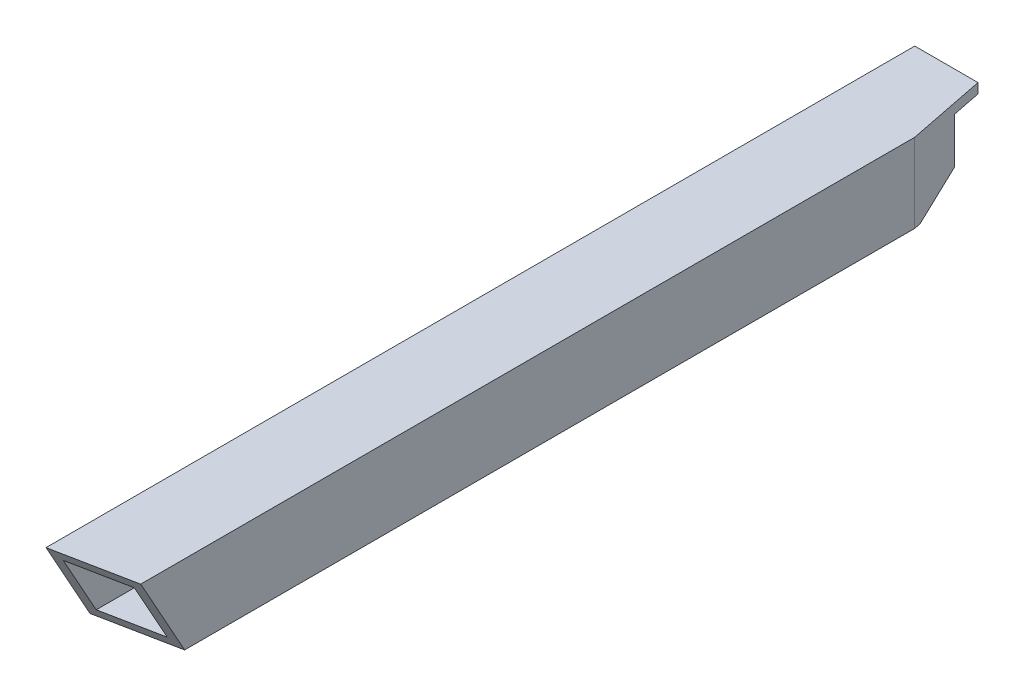
ISO-10303-21;
HEADER;
FILE_DESCRIPTION(('STEP AP214'),'2;1');
FILE_NAME('part.step','',(''),(''),'','','');
FILE_SCHEMA(('AUTOMOTIVE_DESIGN { 1 0 10303 214 1 1 1 1 }'));
ENDSEC;
DATA;
#1=APPLICATION_CONTEXT('core data for automotive mechanical design processes');
#2=APPLICATION_PROTOCOL_DEFINITION('international standard','automotive_design',2000,#1);
#3=PRODUCT_CONTEXT('',#1,'mechanical');
#4=PRODUCT('Part','Part','',(#3));
#5=PRODUCT_RELATED_PRODUCT_CATEGORY('part','',(#4));
#6=PRODUCT_DEFINITION_FORMATION('','',#4);
#7=PRODUCT_DEFINITION_CONTEXT('part definition',#1,'design');
#8=PRODUCT_DEFINITION('design','',#6,#7);
#9=PRODUCT_DEFINITION_SHAPE('','',#8);
#10=(LENGTH_UNIT() NAMED_UNIT(*) SI_UNIT(.MILLI.,.METRE.));
#11=(NAMED_UNIT(*) PLANE_ANGLE_UNIT() SI_UNIT($,.RADIAN.));
#12=(NAMED_UNIT(*) SI_UNIT($,.STERADIAN.) SOLID_ANGLE_UNIT());
#13=UNCERTAINTY_MEASURE_WITH_UNIT(LENGTH_MEASURE(1.E-05),#10,'distance_accuracy_value','');
#14=(GEOMETRIC_REPRESENTATION_CONTEXT(3) GLOBAL_UNCERTAINTY_ASSIGNED_CONTEXT((#13)) GLOBAL_UNIT_ASSIGNED_CONTEXT((#10,
#11,#12)) REPRESENTATION_CONTEXT('',''));
#15=CARTESIAN_POINT('',(0.,0.,0.));
#16=DIRECTION('',(0.,0.,1.));
#17=DIRECTION('',(1.,0.,0.));
#18=AXIS2_PLACEMENT_3D('',#15,#16,#17);
#19=CARTESIAN_POINT('',(12.7,-12.7,139.7));
#20=DIRECTION('',(0.,1.,0.));
#21=DIRECTION('',(0.,0.,1.));
#22=AXIS2_PLACEMENT_3D('',#19,#20,#21);
#23=PLANE('',#22);
#24=DIRECTION('',(-0.999378196944264,0.,-0.0352593175264528));
#25=VECTOR('',#24,1.);
#26=CARTESIAN_POINT('',(21.7243575424984,-12.7,-116.08334471835));
#27=LINE('',#26,#25);
#28=CARTESIAN_POINT('',(12.2785974410021,-12.7,-116.416602994061));
#29=VERTEX_POINT('',#28);
#30=CARTESIAN_POINT('',(-12.7,-12.7,-117.297879272882));
#31=VERTEX_POINT('',#30);
#32=EDGE_CURVE('E125',#29,#31,#27,.T.);
#33=ORIENTED_EDGE('',*,*,#32,.F.);
#34=DIRECTION('',(-0.195261498367845,0.,-0.98075121578061));
#35=VECTOR('',#34,1.);
#36=CARTESIAN_POINT('',(61.3417497875296,-12.7,130.015728602807));
#37=LINE('',#36,#35);
#38=CARTESIAN_POINT('',(12.7,-12.7,-114.3));
#39=VERTEX_POINT('',#38);
#40=EDGE_CURVE('E65',#39,#29,#37,.T.);
#41=ORIENTED_EDGE('',*,*,#40,.F.);
#42=DIRECTION('',(0.,0.,-1.));
#43=VECTOR('',#42,1.);
#44=CARTESIAN_POINT('',(12.7,-12.7,139.7));
#45=LINE('',#44,#43);
#46=CARTESIAN_POINT('',(12.7,-12.7,120.516824075556));
#47=VERTEX_POINT('',#46);
#48=EDGE_CURVE('E214',#47,#39,#45,.T.);
#49=ORIENTED_EDGE('',*,*,#48,.F.);
#50=DIRECTION('',(0.98075121578061,0.,-0.195261498367845));
#51=VECTOR('',#50,1.);
#52=CARTESIAN_POINT('',(9.0263651832796,-12.7,121.248222035841));
#53=LINE('',#52,#51);
#54=CARTESIAN_POINT('',(-12.7,-12.7,125.573806905392));
#55=VERTEX_POINT('',#54);
#56=EDGE_CURVE('E168',#55,#47,#53,.T.);
#57=ORIENTED_EDGE('',*,*,#56,.F.);
#58=DIRECTION('',(0.,0.,-1.));
#59=VECTOR('',#58,1.);
#60=CARTESIAN_POINT('',(-12.7,-12.7,139.7));
#61=LINE('',#60,#59);
#62=EDGE_CURVE('E132',#55,#31,#61,.T.);
#63=ORIENTED_EDGE('',*,*,#62,.T.);
#64=EDGE_LOOP('',(#33,#41,#49,#57,#63));
#65=FACE_BOUND('',#64,.T.);
#66=ADVANCED_FACE('F42',(#65),#23,.F.);
#67=CARTESIAN_POINT('',(9.525,-9.525,139.7));
#68=DIRECTION('',(0.,1.,0.));
#69=DIRECTION('',(0.,0.,1.));
#70=AXIS2_PLACEMENT_3D('',#67,#68,#69);
#71=PLANE('',#70);
#72=DIRECTION('',(0.,0.,-1.));
#73=VECTOR('',#72,1.);
#74=CARTESIAN_POINT('',(9.525,-9.525,139.7));
#75=LINE('',#74,#73);
#76=CARTESIAN_POINT('',(9.525,-9.525,122.914721066111));
#77=VERTEX_POINT('',#76);
#78=CARTESIAN_POINT('',(9.525,-9.52499999999999,-122.338319523298));
#79=VERTEX_POINT('',#78);
#80=EDGE_CURVE('E198',#77,#79,#75,.T.);
#81=ORIENTED_EDGE('',*,*,#80,.T.);
#82=DIRECTION('',(-0.999378196944264,0.,-0.0352593175264528));
#83=VECTOR('',#82,1.);
#84=CARTESIAN_POINT('',(18.7585472919775,-9.525,-122.012548381944));
#85=LINE('',#84,#83);
#86=CARTESIAN_POINT('',(-9.52499999999999,-9.525,-123.010427440934));
#87=VERTEX_POINT('',#86);
#88=EDGE_CURVE('E135',#79,#87,#85,.T.);
#89=ORIENTED_EDGE('',*,*,#88,.T.);
#90=DIRECTION('',(0.,0.,-1.));
#91=VECTOR('',#90,1.);
#92=CARTESIAN_POINT('',(-9.52499999999999,-9.525,139.7));
#93=LINE('',#92,#91);
#94=CARTESIAN_POINT('',(-9.52499999999999,-9.525,126.707458188488));
#95=VERTEX_POINT('',#94);
#96=EDGE_CURVE('E202',#95,#87,#93,.T.);
#97=ORIENTED_EDGE('',*,*,#96,.F.);
#98=DIRECTION('',(0.98075121578061,0.,-0.195261498367845));
#99=VECTOR('',#98,1.);
#100=CARTESIAN_POINT('',(6.31056953536965,-9.525,123.554694281361));
#101=LINE('',#100,#99);
#102=EDGE_CURVE('E147',#95,#77,#101,.T.);
#103=ORIENTED_EDGE('',*,*,#102,.T.);
#104=EDGE_LOOP('',(#81,#89,#97,#103));
#105=FACE_BOUND('',#104,.T.);
#106=ADVANCED_FACE('F268',(#105),#71,.T.);
#107=CARTESIAN_POINT('',(9.525,-9.525,139.7));
#108=DIRECTION('',(-1.,0.,0.));
#109=DIRECTION('',(0.,0.,1.));
#110=AXIS2_PLACEMENT_3D('',#107,#108,#109);
#111=PLANE('',#110);
#112=DIRECTION('',(0.,-1.,0.));
#113=VECTOR('',#112,1.);
#114=CARTESIAN_POINT('',(9.525,-9.525,-130.247256044493));
#115=LINE('',#114,#113);
#116=CARTESIAN_POINT('',(9.525,9.525,-130.247256044493));
#117=VERTEX_POINT('',#116);
#118=CARTESIAN_POINT('',(9.525,-5.21379933896037,-130.247256044493));
#119=VERTEX_POINT('',#118);
#120=EDGE_CURVE('E250',#117,#119,#115,.T.);
#121=ORIENTED_EDGE('',*,*,#120,.T.);
#122=DIRECTION('',(0.,-0.478615562436227,0.878024568787146));
#123=VECTOR('',#122,1.);
#124=CARTESIAN_POINT('',(9.525,-119.642993631327,79.674133606524));
#125=LINE('',#124,#123);
#126=EDGE_CURVE('E58',#119,#79,#125,.T.);
#127=ORIENTED_EDGE('',*,*,#126,.T.);
#128=ORIENTED_EDGE('',*,*,#80,.F.);
#129=DIRECTION('',(0.,0.873936887721125,0.486039418442901));
#130=VECTOR('',#129,1.);
#131=CARTESIAN_POINT('',(9.525,-2.39515438657077,126.879979958633));
#132=LINE('',#131,#130);
#133=CARTESIAN_POINT('',(9.525,9.525,133.509365887068));
#134=VERTEX_POINT('',#133);
#135=EDGE_CURVE('E142',#77,#134,#132,.T.);
#136=ORIENTED_EDGE('',*,*,#135,.T.);
#137=DIRECTION('',(0.,0.,-1.));
#138=VECTOR('',#137,1.);
#139=CARTESIAN_POINT('',(9.525,9.525,139.7));
#140=LINE('',#139,#138);
#141=EDGE_CURVE('E194',#134,#117,#140,.T.);
#142=ORIENTED_EDGE('',*,*,#141,.T.);
#143=EDGE_LOOP('',(#121,#127,#128,#136,#142));
#144=FACE_BOUND('',#143,.T.);
#145=ADVANCED_FACE('F266',(#144),#111,.T.);
#146=CARTESIAN_POINT('',(0.,0.,-139.7));
#147=DIRECTION('',(0.,0.,1.));
#148=DIRECTION('',(1.,0.,0.));
#149=AXIS2_PLACEMENT_3D('',#146,#147,#148);
#150=PLANE('',#149);
#151=DIRECTION('',(0.999815116604603,0.0192284323054417,0.));
#152=VECTOR('',#151,1.);
#153=CARTESIAN_POINT('',(0.00469560413334753,-0.244155941552411,-139.7));
#154=LINE('',#153,#152);
#155=CARTESIAN_POINT('',(-12.7,-0.488492494709281,-139.7));
#156=VERTEX_POINT('',#155);
#157=CARTESIAN_POINT('',(-9.52499999999999,-0.427430932870648,-139.7));
#158=VERTEX_POINT('',#157);
#159=EDGE_CURVE('E240',#156,#158,#154,.T.);
#160=ORIENTED_EDGE('',*,*,#159,.F.);
#161=DIRECTION('',(0.,-1.,0.));
#162=VECTOR('',#161,1.);
#163=CARTESIAN_POINT('',(-12.7,-12.7,-139.7));
#164=LINE('',#163,#162);
#165=CARTESIAN_POINT('',(-12.7,12.7,-139.7));
#166=VERTEX_POINT('',#165);
#167=EDGE_CURVE('E183',#166,#156,#164,.T.);
#168=ORIENTED_EDGE('',*,*,#167,.F.);
#169=DIRECTION('',(-1.,0.,0.));
#170=VECTOR('',#169,1.);
#171=CARTESIAN_POINT('',(12.7,12.7,-139.7));
#172=LINE('',#171,#170);
#173=CARTESIAN_POINT('',(7.64301717016406,12.7,-139.7));
#174=VERTEX_POINT('',#173);
#175=EDGE_CURVE('E187',#174,#166,#172,.T.);
#176=ORIENTED_EDGE('',*,*,#175,.F.);
#177=DIRECTION('',(0.,1.,0.));
#178=VECTOR('',#177,1.);
#179=CARTESIAN_POINT('',(7.64301717016406,0.,-139.7));
#180=LINE('',#179,#178);
#181=CARTESIAN_POINT('',(7.64301717016406,9.525,-139.7));
#182=VERTEX_POINT('',#181);
#183=EDGE_CURVE('E51',#182,#174,#180,.T.);
#184=ORIENTED_EDGE('',*,*,#183,.F.);
#185=DIRECTION('',(-1.,0.,0.));
#186=VECTOR('',#185,1.);
#187=CARTESIAN_POINT('',(9.525,9.525,-139.7));
#188=LINE('',#187,#186);
#189=CARTESIAN_POINT('',(-9.52499999999999,9.525,-139.7));
#190=VERTEX_POINT('',#189);
#191=EDGE_CURVE('E180',#182,#190,#188,.T.);
#192=ORIENTED_EDGE('',*,*,#191,.T.);
#193=DIRECTION('',(0.,-1.,0.));
#194=VECTOR('',#193,1.);
#195=CARTESIAN_POINT('',(-9.52499999999999,-9.525,-139.7));
#196=LINE('',#195,#194);
#197=EDGE_CURVE('E176',#190,#158,#196,.T.);
#198=ORIENTED_EDGE('',*,*,#197,.T.);
#199=EDGE_LOOP('',(#160,#168,#176,#184,#192,#198));
#200=FACE_BOUND('',#199,.T.);
#201=ADVANCED_FACE('F230',(#200),#150,.F.);
#202=CARTESIAN_POINT('',(-12.7,-12.7,139.7));
#203=DIRECTION('',(1.,0.,0.));
#204=DIRECTION('',(0.,0.,-1.));
#205=AXIS2_PLACEMENT_3D('',#202,#203,#204);
#206=PLANE('',#205);
#207=DIRECTION('',(0.,0.478615562436227,-0.878024568787146));
#208=VECTOR('',#207,1.);
#209=CARTESIAN_POINT('',(-12.7,-120.699818059128,80.8287616532395));
#210=LINE('',#209,#208);
#211=EDGE_CURVE('E242',#31,#156,#210,.T.);
#212=ORIENTED_EDGE('',*,*,#211,.F.);
#213=ORIENTED_EDGE('',*,*,#62,.F.);
#214=DIRECTION('',(0.,-0.873936887721125,-0.486039418442901));
#215=VECTOR('',#214,1.);
#216=CARTESIAN_POINT('',(-12.7,-6.69964836648003,128.91089847274));
#217=LINE('',#216,#215);
#218=CARTESIAN_POINT('',(-12.7,12.7,139.7));
#219=VERTEX_POINT('',#218);
#220=EDGE_CURVE('E172',#219,#55,#217,.T.);
#221=ORIENTED_EDGE('',*,*,#220,.F.);
#222=DIRECTION('',(0.,0.,-1.));
#223=VECTOR('',#222,1.);
#224=CARTESIAN_POINT('',(-12.7,12.7,139.7));
#225=LINE('',#224,#223);
#226=EDGE_CURVE('E206',#219,#166,#225,.T.);
#227=ORIENTED_EDGE('',*,*,#226,.T.);
#228=ORIENTED_EDGE('',*,*,#167,.T.);
#229=EDGE_LOOP('',(#212,#213,#221,#227,#228));
#230=FACE_BOUND('',#229,.T.);
#231=ADVANCED_FACE('F44',(#230),#206,.F.);
#232=CARTESIAN_POINT('',(-9.52499999999999,-9.525,139.7));
#233=DIRECTION('',(1.,0.,0.));
#234=DIRECTION('',(0.,0.,-1.));
#235=AXIS2_PLACEMENT_3D('',#232,#233,#234);
#236=PLANE('',#235);
#237=ORIENTED_EDGE('',*,*,#96,.T.);
#238=DIRECTION('',(0.,0.478615562436227,-0.878024568787146));
#239=VECTOR('',#238,1.);
#240=CARTESIAN_POINT('',(-9.52499999999999,-119.925437723964,79.5201719258836));
#241=LINE('',#240,#239);
#242=EDGE_CURVE('E134',#87,#158,#241,.T.);
#243=ORIENTED_EDGE('',*,*,#242,.T.);
#244=ORIENTED_EDGE('',*,*,#197,.F.);
#245=DIRECTION('',(0.,0.,-1.));
#246=VECTOR('',#245,1.);
#247=CARTESIAN_POINT('',(-9.52499999999999,9.525,139.7));
#248=LINE('',#247,#246);
#249=CARTESIAN_POINT('',(-9.52499999999999,9.525,137.302103009444));
#250=VERTEX_POINT('',#249);
#251=EDGE_CURVE('E190',#250,#190,#248,.T.);
#252=ORIENTED_EDGE('',*,*,#251,.F.);
#253=DIRECTION('',(0.,-0.873936887721125,-0.486039418442901));
#254=VECTOR('',#253,1.);
#255=CARTESIAN_POINT('',(-9.52499999999999,-4.00618690151299,129.776742420074));
#256=LINE('',#255,#254);
#257=EDGE_CURVE('E156',#250,#95,#256,.T.);
#258=ORIENTED_EDGE('',*,*,#257,.T.);
#259=EDGE_LOOP('',(#237,#243,#244,#252,#258));
#260=FACE_BOUND('',#259,.T.);
#261=ADVANCED_FACE('F239',(#260),#236,.T.);
#262=CARTESIAN_POINT('',(34.1045738345287,0.,-6.79000961811353));
#263=DIRECTION('',(0.98075121578061,0.,-0.195261498367845));
#264=DIRECTION('',(-0.195261498367845,0.,-0.98075121578061));
#265=AXIS2_PLACEMENT_3D('',#262,#263,#264);
#266=PLANE('',#265);
#267=ORIENTED_EDGE('',*,*,#40,.T.);
#268=DIRECTION('',(-0.17246656544568,0.46888455698768,-0.86625778843358));
#269=VECTOR('',#268,1.);
#270=CARTESIAN_POINT('',(28.2790636419124,-56.2004401393561,-36.050136431171));
#271=LINE('',#270,#269);
#272=EDGE_CURVE('E12',#29,#119,#271,.T.);
#273=ORIENTED_EDGE('',*,*,#272,.T.);
#274=ORIENTED_EDGE('',*,*,#120,.F.);
#275=DIRECTION('',(0.195261498367845,0.,0.98075121578061));
#276=VECTOR('',#275,1.);
#277=CARTESIAN_POINT('',(61.2206963950647,9.525,129.407706730462));
#278=LINE('',#277,#276);
#279=EDGE_CURVE('E226',#182,#117,#278,.T.);
#280=ORIENTED_EDGE('',*,*,#279,.F.);
#281=ORIENTED_EDGE('',*,*,#183,.T.);
#282=DIRECTION('',(0.195261498367845,0.,0.98075121578061));
#283=VECTOR('',#282,1.);
#284=CARTESIAN_POINT('',(61.3417497875296,12.7,130.015728602807));
#285=LINE('',#284,#283);
#286=CARTESIAN_POINT('',(12.7,12.7,-114.3));
#287=VERTEX_POINT('',#286);
#288=EDGE_CURVE('E149',#174,#287,#285,.T.);
#289=ORIENTED_EDGE('',*,*,#288,.T.);
#290=DIRECTION('',(0.,-1.,0.));
#291=VECTOR('',#290,1.);
#292=CARTESIAN_POINT('',(12.7,-12.7,-114.3));
#293=LINE('',#292,#291);
#294=EDGE_CURVE('E140',#287,#39,#293,.T.);
#295=ORIENTED_EDGE('',*,*,#294,.T.);
#296=EDGE_LOOP('',(#267,#273,#274,#280,#281,#289,#295));
#297=FACE_BOUND('',#296,.T.);
#298=ADVANCED_FACE('F138',(#297),#266,.T.);
#299=CARTESIAN_POINT('',(12.7,-12.7,139.7));
#300=DIRECTION('',(-1.,0.,0.));
#301=DIRECTION('',(0.,0.,1.));
#302=AXIS2_PLACEMENT_3D('',#299,#300,#301);
#303=PLANE('',#302);
#304=ORIENTED_EDGE('',*,*,#294,.F.);
#305=DIRECTION('',(0.,0.,-1.));
#306=VECTOR('',#305,1.);
#307=CARTESIAN_POINT('',(12.7,12.7,139.7));
#308=LINE('',#307,#306);
#309=CARTESIAN_POINT('',(12.7,12.7,134.643017170164));
#310=VERTEX_POINT('',#309);
#311=EDGE_CURVE('E210',#310,#287,#308,.T.);
#312=ORIENTED_EDGE('',*,*,#311,.F.);
#313=DIRECTION('',(0.,0.873936887721125,0.486039418442901));
#314=VECTOR('',#313,1.);
#315=CARTESIAN_POINT('',(12.7,-4.55160501322374,125.048548524152));
#316=LINE('',#315,#314);
#317=EDGE_CURVE('E164',#47,#310,#316,.T.);
#318=ORIENTED_EDGE('',*,*,#317,.F.);
#319=ORIENTED_EDGE('',*,*,#48,.T.);
#320=EDGE_LOOP('',(#304,#312,#318,#319));
#321=FACE_BOUND('',#320,.T.);
#322=ADVANCED_FACE('F276',(#321),#303,.F.);
#323=CARTESIAN_POINT('',(12.7,12.7,139.7));
#324=DIRECTION('',(0.,-1.,0.));
#325=DIRECTION('',(0.,0.,-1.));
#326=AXIS2_PLACEMENT_3D('',#323,#324,#325);
#327=PLANE('',#326);
#328=ORIENTED_EDGE('',*,*,#288,.F.);
#329=ORIENTED_EDGE('',*,*,#175,.T.);
#330=ORIENTED_EDGE('',*,*,#226,.F.);
#331=DIRECTION('',(-0.98075121578061,0.,0.195261498367845));
#332=VECTOR('',#331,1.);
#333=CARTESIAN_POINT('',(11.7315728602807,12.7,134.835825021247));
#334=LINE('',#333,#332);
#335=EDGE_CURVE('E160',#310,#219,#334,.T.);
#336=ORIENTED_EDGE('',*,*,#335,.F.);
#337=ORIENTED_EDGE('',*,*,#311,.T.);
#338=EDGE_LOOP('',(#328,#329,#330,#336,#337));
#339=FACE_BOUND('',#338,.T.);
#340=ADVANCED_FACE('F247',(#339),#327,.F.);
#341=CARTESIAN_POINT('',(9.525,9.525,139.7));
#342=DIRECTION('',(0.,-1.,0.));
#343=DIRECTION('',(0.,0.,-1.));
#344=AXIS2_PLACEMENT_3D('',#341,#342,#343);
#345=PLANE('',#344);
#346=ORIENTED_EDGE('',*,*,#191,.F.);
#347=ORIENTED_EDGE('',*,*,#279,.T.);
#348=ORIENTED_EDGE('',*,*,#141,.F.);
#349=DIRECTION('',(-0.98075121578061,0.,0.195261498367845));
#350=VECTOR('',#349,1.);
#351=CARTESIAN_POINT('',(8.33947529312044,9.525,133.745396520415));
#352=LINE('',#351,#350);
#353=EDGE_CURVE('E219',#134,#250,#352,.T.);
#354=ORIENTED_EDGE('',*,*,#353,.T.);
#355=ORIENTED_EDGE('',*,*,#251,.T.);
#356=EDGE_LOOP('',(#346,#347,#348,#354,#355));
#357=FACE_BOUND('',#356,.T.);
#358=ADVANCED_FACE('F233',(#357),#345,.T.);
#359=CARTESIAN_POINT('',(19.203056865409,-53.6418845812678,96.4523038329581));
#360=DIRECTION('',(0.171419955104357,-0.478845087585913,0.861000918168419));
#361=DIRECTION('',(0.,-0.873936887721125,-0.486039418442901));
#362=AXIS2_PLACEMENT_3D('',#359,#360,#361);
#363=PLANE('',#362);
#364=ORIENTED_EDGE('',*,*,#257,.F.);
#365=ORIENTED_EDGE('',*,*,#353,.F.);
#366=ORIENTED_EDGE('',*,*,#135,.F.);
#367=ORIENTED_EDGE('',*,*,#102,.F.);
#368=EDGE_LOOP('',(#364,#365,#366,#367));
#369=FACE_BOUND('',#368,.T.);
#370=ORIENTED_EDGE('',*,*,#335,.T.);
#371=ORIENTED_EDGE('',*,*,#220,.T.);
#372=ORIENTED_EDGE('',*,*,#56,.T.);
#373=ORIENTED_EDGE('',*,*,#317,.T.);
#374=EDGE_LOOP('',(#370,#371,#372,#373));
#375=FACE_BOUND('',#374,.T.);
#376=ADVANCED_FACE('F271',(#369,#375),#363,.T.);
#377=CARTESIAN_POINT('',(1.13235075116121,-58.8785076352352,-32.0949675544618));
#378=DIRECTION('',(0.0168837509891738,-0.877899414565723,-0.478547340247228));
#379=DIRECTION('',(0.,0.478615562436227,-0.878024568787146));
#380=AXIS2_PLACEMENT_3D('',#377,#378,#379);
#381=PLANE('',#380);
#382=ORIENTED_EDGE('',*,*,#211,.T.);
#383=ORIENTED_EDGE('',*,*,#159,.T.);
#384=ORIENTED_EDGE('',*,*,#242,.F.);
#385=ORIENTED_EDGE('',*,*,#88,.F.);
#386=ORIENTED_EDGE('',*,*,#126,.F.);
#387=ORIENTED_EDGE('',*,*,#272,.F.);
#388=ORIENTED_EDGE('',*,*,#32,.T.);
#389=EDGE_LOOP('',(#382,#383,#384,#385,#386,#387,#388));
#390=FACE_BOUND('',#389,.T.);
#391=ADVANCED_FACE('F124',(#390),#381,.T.);
#392=CLOSED_SHELL('',(#66,#106,#145,#201,#231,#261,#298,#322,#340,#358,#376,#391));
#393=MANIFOLD_SOLID_BREP('B2',#392);
#394=ADVANCED_BREP_SHAPE_REPRESENTATION('',(#18,#393),#14);
#395=SHAPE_DEFINITION_REPRESENTATION(#9,#394);
ENDSEC;
END-ISO-10303-21;
